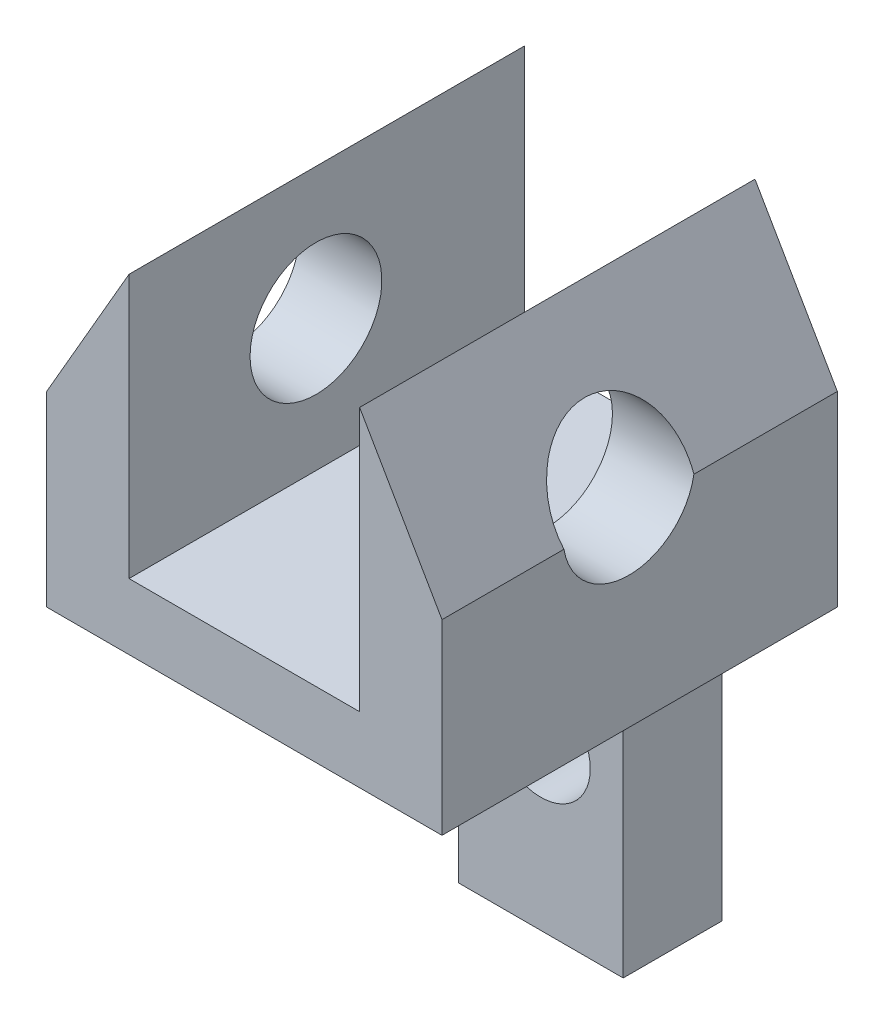
ISO-10303-21;
HEADER;
FILE_DESCRIPTION(('STEP AP214'),'2;1');
FILE_NAME('part.step','',(''),(''),'','','');
FILE_SCHEMA(('AUTOMOTIVE_DESIGN { 1 0 10303 214 1 1 1 1 }'));
ENDSEC;
DATA;
#1=APPLICATION_CONTEXT('core data for automotive mechanical design processes');
#2=APPLICATION_PROTOCOL_DEFINITION('international standard','automotive_design',2000,#1);
#3=PRODUCT_CONTEXT('',#1,'mechanical');
#4=PRODUCT('Part','Part','',(#3));
#5=PRODUCT_RELATED_PRODUCT_CATEGORY('part','',(#4));
#6=PRODUCT_DEFINITION_FORMATION('','',#4);
#7=PRODUCT_DEFINITION_CONTEXT('part definition',#1,'design');
#8=PRODUCT_DEFINITION('design','',#6,#7);
#9=PRODUCT_DEFINITION_SHAPE('','',#8);
#10=(LENGTH_UNIT() NAMED_UNIT(*) SI_UNIT(.MILLI.,.METRE.));
#11=(NAMED_UNIT(*) PLANE_ANGLE_UNIT() SI_UNIT($,.RADIAN.));
#12=(NAMED_UNIT(*) SI_UNIT($,.STERADIAN.) SOLID_ANGLE_UNIT());
#13=UNCERTAINTY_MEASURE_WITH_UNIT(LENGTH_MEASURE(1.E-05),#10,'distance_accuracy_value','');
#14=(GEOMETRIC_REPRESENTATION_CONTEXT(3) GLOBAL_UNCERTAINTY_ASSIGNED_CONTEXT((#13)) GLOBAL_UNIT_ASSIGNED_CONTEXT((#10,
#11,#12)) REPRESENTATION_CONTEXT('',''));
#15=CARTESIAN_POINT('',(0.,0.,0.));
#16=DIRECTION('',(0.,0.,1.));
#17=DIRECTION('',(1.,0.,0.));
#18=AXIS2_PLACEMENT_3D('',#15,#16,#17);
#19=CARTESIAN_POINT('',(-6.,2.,6.));
#20=DIRECTION('',(1.,0.,0.));
#21=DIRECTION('',(0.,0.,-1.));
#22=AXIS2_PLACEMENT_3D('',#19,#20,#21);
#23=PLANE('',#22);
#24=CARTESIAN_POINT('',(-6.,6.,0.326138493477825));
#25=DIRECTION('',(-1.,0.,0.));
#26=DIRECTION('',(0.,0.,1.));
#27=AXIS2_PLACEMENT_3D('',#24,#25,#26);
#28=CIRCLE('',#27,2.);
#29=CARTESIAN_POINT('',(-6.,5.66987298107782,-1.64642738663304));
#30=VERTEX_POINT('',#29);
#31=CARTESIAN_POINT('',(-6.,5.66987298107782,2.29870437358869));
#32=VERTEX_POINT('',#31);
#33=EDGE_CURVE('E171',#30,#32,#28,.T.);
#34=ORIENTED_EDGE('',*,*,#33,.F.);
#35=DIRECTION('',(0.,0.,1.));
#36=VECTOR('',#35,1.);
#37=CARTESIAN_POINT('',(-6.,5.66987298107782,-6.));
#38=LINE('',#37,#36);
#39=CARTESIAN_POINT('',(-6.,5.66987298107782,-6.));
#40=VERTEX_POINT('',#39);
#41=EDGE_CURVE('E210',#40,#30,#38,.T.);
#42=ORIENTED_EDGE('',*,*,#41,.F.);
#43=DIRECTION('',(0.,-1.,0.));
#44=VECTOR('',#43,1.);
#45=CARTESIAN_POINT('',(-6.,2.,-6.));
#46=LINE('',#45,#44);
#47=CARTESIAN_POINT('',(-6.,0.,-6.));
#48=VERTEX_POINT('',#47);
#49=EDGE_CURVE('E278',#40,#48,#46,.T.);
#50=ORIENTED_EDGE('',*,*,#49,.T.);
#51=DIRECTION('',(0.,0.,1.));
#52=VECTOR('',#51,1.);
#53=CARTESIAN_POINT('',(-6.,0.,6.));
#54=LINE('',#53,#52);
#55=CARTESIAN_POINT('',(-6.,0.,6.));
#56=VERTEX_POINT('',#55);
#57=EDGE_CURVE('E268',#48,#56,#54,.T.);
#58=ORIENTED_EDGE('',*,*,#57,.T.);
#59=DIRECTION('',(0.,-1.,0.));
#60=VECTOR('',#59,1.);
#61=CARTESIAN_POINT('',(-6.,2.,6.));
#62=LINE('',#61,#60);
#63=CARTESIAN_POINT('',(-6.,5.66987298107781,6.));
#64=VERTEX_POINT('',#63);
#65=EDGE_CURVE('E280',#64,#56,#62,.T.);
#66=ORIENTED_EDGE('',*,*,#65,.F.);
#67=EDGE_CURVE('E205',#32,#64,#38,.T.);
#68=ORIENTED_EDGE('',*,*,#67,.F.);
#69=EDGE_LOOP('',(#34,#42,#50,#58,#66,#68));
#70=FACE_BOUND('',#69,.T.);
#71=ADVANCED_FACE('F44',(#70),#23,.F.);
#72=CARTESIAN_POINT('',(-6.,2.,6.));
#73=DIRECTION('',(0.,0.,-1.));
#74=DIRECTION('',(-1.,0.,0.));
#75=AXIS2_PLACEMENT_3D('',#72,#73,#74);
#76=PLANE('',#75);
#77=DIRECTION('',(0.500000000000001,0.866025403784438,0.));
#78=VECTOR('',#77,1.);
#79=CARTESIAN_POINT('',(-3.5,10.,6.));
#80=LINE('',#79,#78);
#81=CARTESIAN_POINT('',(-3.5,10.,6.));
#82=VERTEX_POINT('',#81);
#83=EDGE_CURVE('E201',#64,#82,#80,.T.);
#84=ORIENTED_EDGE('',*,*,#83,.F.);
#85=ORIENTED_EDGE('',*,*,#65,.T.);
#86=DIRECTION('',(1.,0.,0.));
#87=VECTOR('',#86,1.);
#88=CARTESIAN_POINT('',(-6.,0.,6.));
#89=LINE('',#88,#87);
#90=CARTESIAN_POINT('',(6.,0.,6.));
#91=VERTEX_POINT('',#90);
#92=EDGE_CURVE('E260',#56,#91,#89,.T.);
#93=ORIENTED_EDGE('',*,*,#92,.T.);
#94=DIRECTION('',(0.,-1.,0.));
#95=VECTOR('',#94,1.);
#96=CARTESIAN_POINT('',(6.,2.,6.));
#97=LINE('',#96,#95);
#98=CARTESIAN_POINT('',(6.,5.66987298107782,6.));
#99=VERTEX_POINT('',#98);
#100=EDGE_CURVE('E257',#99,#91,#97,.T.);
#101=ORIENTED_EDGE('',*,*,#100,.F.);
#102=DIRECTION('',(0.500000000000001,-0.866025403784438,0.));
#103=VECTOR('',#102,1.);
#104=CARTESIAN_POINT('',(3.5,10.,6.));
#105=LINE('',#104,#103);
#106=CARTESIAN_POINT('',(3.5,10.,6.));
#107=VERTEX_POINT('',#106);
#108=EDGE_CURVE('E206',#107,#99,#105,.T.);
#109=ORIENTED_EDGE('',*,*,#108,.F.);
#110=DIRECTION('',(0.,-1.,0.));
#111=VECTOR('',#110,1.);
#112=CARTESIAN_POINT('',(3.5,10.,6.));
#113=LINE('',#112,#111);
#114=CARTESIAN_POINT('',(3.5,2.,6.));
#115=VERTEX_POINT('',#114);
#116=EDGE_CURVE('E245',#107,#115,#113,.T.);
#117=ORIENTED_EDGE('',*,*,#116,.T.);
#118=DIRECTION('',(1.,0.,0.));
#119=VECTOR('',#118,1.);
#120=CARTESIAN_POINT('',(-6.,2.,6.));
#121=LINE('',#120,#119);
#122=CARTESIAN_POINT('',(-3.5,2.,6.));
#123=VERTEX_POINT('',#122);
#124=EDGE_CURVE('E258',#123,#115,#121,.T.);
#125=ORIENTED_EDGE('',*,*,#124,.F.);
#126=DIRECTION('',(0.,-1.,0.));
#127=VECTOR('',#126,1.);
#128=CARTESIAN_POINT('',(-3.5,10.,6.));
#129=LINE('',#128,#127);
#130=EDGE_CURVE('E232',#82,#123,#129,.T.);
#131=ORIENTED_EDGE('',*,*,#130,.F.);
#132=EDGE_LOOP('',(#84,#85,#93,#101,#109,#117,#125,#131));
#133=FACE_BOUND('',#132,.T.);
#134=ADVANCED_FACE('F298',(#133),#76,.F.);
#135=CARTESIAN_POINT('',(0.,2.,0.));
#136=DIRECTION('',(0.,-1.,0.));
#137=DIRECTION('',(0.,0.,-1.));
#138=AXIS2_PLACEMENT_3D('',#135,#136,#137);
#139=PLANE('',#138);
#140=DIRECTION('',(0.,0.,-1.));
#141=VECTOR('',#140,1.);
#142=CARTESIAN_POINT('',(-3.5,2.,-6.));
#143=LINE('',#142,#141);
#144=CARTESIAN_POINT('',(-3.5,2.,-6.));
#145=VERTEX_POINT('',#144);
#146=EDGE_CURVE('E226',#123,#145,#143,.T.);
#147=ORIENTED_EDGE('',*,*,#146,.F.);
#148=ORIENTED_EDGE('',*,*,#124,.T.);
#149=DIRECTION('',(0.,0.,1.));
#150=VECTOR('',#149,1.);
#151=CARTESIAN_POINT('',(3.5,2.,6.));
#152=LINE('',#151,#150);
#153=CARTESIAN_POINT('',(3.5,2.,-6.));
#154=VERTEX_POINT('',#153);
#155=EDGE_CURVE('E234',#154,#115,#152,.T.);
#156=ORIENTED_EDGE('',*,*,#155,.F.);
#157=DIRECTION('',(-1.,0.,0.));
#158=VECTOR('',#157,1.);
#159=CARTESIAN_POINT('',(-6.,2.,-6.));
#160=LINE('',#159,#158);
#161=EDGE_CURVE('E251',#154,#145,#160,.T.);
#162=ORIENTED_EDGE('',*,*,#161,.T.);
#163=EDGE_LOOP('',(#147,#148,#156,#162));
#164=FACE_BOUND('',#163,.T.);
#165=ADVANCED_FACE('F348',(#164),#139,.F.);
#166=CARTESIAN_POINT('',(6.,2.,6.));
#167=DIRECTION('',(-1.,0.,0.));
#168=DIRECTION('',(0.,0.,1.));
#169=AXIS2_PLACEMENT_3D('',#166,#167,#168);
#170=PLANE('',#169);
#171=DIRECTION('',(0.,0.,1.));
#172=VECTOR('',#171,1.);
#173=CARTESIAN_POINT('',(6.,5.66987298107782,-6.));
#174=LINE('',#173,#172);
#175=CARTESIAN_POINT('',(6.,5.66987298107782,-6.));
#176=VERTEX_POINT('',#175);
#177=CARTESIAN_POINT('',(6.,5.66987298107782,-1.64642738663304));
#178=VERTEX_POINT('',#177);
#179=EDGE_CURVE('E215',#176,#178,#174,.T.);
#180=ORIENTED_EDGE('',*,*,#179,.T.);
#181=CARTESIAN_POINT('',(6.,6.,0.326138493477825));
#182=DIRECTION('',(-1.,0.,0.));
#183=DIRECTION('',(0.,0.,1.));
#184=AXIS2_PLACEMENT_3D('',#181,#182,#183);
#185=CIRCLE('',#184,2.);
#186=CARTESIAN_POINT('',(6.,5.66987298107782,2.29870437358869));
#187=VERTEX_POINT('',#186);
#188=EDGE_CURVE('E179',#178,#187,#185,.T.);
#189=ORIENTED_EDGE('',*,*,#188,.T.);
#190=EDGE_CURVE('E197',#187,#99,#174,.T.);
#191=ORIENTED_EDGE('',*,*,#190,.T.);
#192=ORIENTED_EDGE('',*,*,#100,.T.);
#193=DIRECTION('',(0.,0.,-1.));
#194=VECTOR('',#193,1.);
#195=CARTESIAN_POINT('',(6.,0.,6.));
#196=LINE('',#195,#194);
#197=CARTESIAN_POINT('',(6.,0.,-6.));
#198=VERTEX_POINT('',#197);
#199=EDGE_CURVE('E239',#91,#198,#196,.T.);
#200=ORIENTED_EDGE('',*,*,#199,.T.);
#201=DIRECTION('',(0.,-1.,0.));
#202=VECTOR('',#201,1.);
#203=CARTESIAN_POINT('',(6.,2.,-6.));
#204=LINE('',#203,#202);
#205=EDGE_CURVE('E53',#176,#198,#204,.T.);
#206=ORIENTED_EDGE('',*,*,#205,.F.);
#207=EDGE_LOOP('',(#180,#189,#191,#192,#200,#206));
#208=FACE_BOUND('',#207,.T.);
#209=ADVANCED_FACE('F50',(#208),#170,.F.);
#210=CARTESIAN_POINT('',(-6.,2.,-6.));
#211=DIRECTION('',(0.,0.,1.));
#212=DIRECTION('',(1.,0.,0.));
#213=AXIS2_PLACEMENT_3D('',#210,#211,#212);
#214=PLANE('',#213);
#215=CARTESIAN_POINT('',(0.,-5.,-6.));
#216=DIRECTION('',(0.,0.,1.));
#217=DIRECTION('',(1.,0.,0.));
#218=AXIS2_PLACEMENT_3D('',#215,#216,#217);
#219=CIRCLE('',#218,1.49999999999999);
#220=CARTESIAN_POINT('',(1.49999999999999,-5.,-6.));
#221=VERTEX_POINT('',#220);
#222=EDGE_CURVE('E357',#221,#221,#219,.T.);
#223=ORIENTED_EDGE('',*,*,#222,.T.);
#224=EDGE_LOOP('',(#223));
#225=FACE_BOUND('',#224,.T.);
#226=ORIENTED_EDGE('',*,*,#49,.F.);
#227=DIRECTION('',(0.500000000000001,0.866025403784438,0.));
#228=VECTOR('',#227,1.);
#229=CARTESIAN_POINT('',(-3.5,10.,-6.));
#230=LINE('',#229,#228);
#231=CARTESIAN_POINT('',(-3.5,10.,-6.));
#232=VERTEX_POINT('',#231);
#233=EDGE_CURVE('E196',#40,#232,#230,.T.);
#234=ORIENTED_EDGE('',*,*,#233,.T.);
#235=DIRECTION('',(0.,-1.,0.));
#236=VECTOR('',#235,1.);
#237=CARTESIAN_POINT('',(-3.5,10.,-6.));
#238=LINE('',#237,#236);
#239=EDGE_CURVE('E229',#232,#145,#238,.T.);
#240=ORIENTED_EDGE('',*,*,#239,.T.);
#241=ORIENTED_EDGE('',*,*,#161,.F.);
#242=DIRECTION('',(0.,-1.,0.));
#243=VECTOR('',#242,1.);
#244=CARTESIAN_POINT('',(3.5,10.,-6.));
#245=LINE('',#244,#243);
#246=CARTESIAN_POINT('',(3.5,10.,-6.));
#247=VERTEX_POINT('',#246);
#248=EDGE_CURVE('E211',#247,#154,#245,.T.);
#249=ORIENTED_EDGE('',*,*,#248,.F.);
#250=DIRECTION('',(0.500000000000001,-0.866025403784438,0.));
#251=VECTOR('',#250,1.);
#252=CARTESIAN_POINT('',(3.5,10.,-6.));
#253=LINE('',#252,#251);
#254=EDGE_CURVE('E216',#247,#176,#253,.T.);
#255=ORIENTED_EDGE('',*,*,#254,.T.);
#256=ORIENTED_EDGE('',*,*,#205,.T.);
#257=DIRECTION('',(-1.,0.,0.));
#258=VECTOR('',#257,1.);
#259=CARTESIAN_POINT('',(-6.,0.,-6.));
#260=LINE('',#259,#258);
#261=CARTESIAN_POINT('',(2.5,0.,-6.));
#262=VERTEX_POINT('',#261);
#263=EDGE_CURVE('E262',#198,#262,#260,.T.);
#264=ORIENTED_EDGE('',*,*,#263,.T.);
#265=DIRECTION('',(0.,1.,0.));
#266=VECTOR('',#265,1.);
#267=CARTESIAN_POINT('',(2.5,-10.,-6.));
#268=LINE('',#267,#266);
#269=CARTESIAN_POINT('',(2.5,-10.,-6.));
#270=VERTEX_POINT('',#269);
#271=EDGE_CURVE('E372',#270,#262,#268,.T.);
#272=ORIENTED_EDGE('',*,*,#271,.F.);
#273=DIRECTION('',(1.,0.,0.));
#274=VECTOR('',#273,1.);
#275=CARTESIAN_POINT('',(2.5,-10.,-6.));
#276=LINE('',#275,#274);
#277=CARTESIAN_POINT('',(-2.5,-10.,-6.));
#278=VERTEX_POINT('',#277);
#279=EDGE_CURVE('E165',#278,#270,#276,.T.);
#280=ORIENTED_EDGE('',*,*,#279,.F.);
#281=DIRECTION('',(0.,1.,0.));
#282=VECTOR('',#281,1.);
#283=CARTESIAN_POINT('',(-2.5,-10.,-6.));
#284=LINE('',#283,#282);
#285=CARTESIAN_POINT('',(-2.5,0.,-6.));
#286=VERTEX_POINT('',#285);
#287=EDGE_CURVE('E180',#278,#286,#284,.T.);
#288=ORIENTED_EDGE('',*,*,#287,.T.);
#289=EDGE_CURVE('E66',#286,#48,#260,.T.);
#290=ORIENTED_EDGE('',*,*,#289,.T.);
#291=EDGE_LOOP('',(#226,#234,#240,#241,#249,#255,#256,#264,#272,#280,#288,#290));
#292=FACE_BOUND('',#291,.T.);
#293=ADVANCED_FACE('F290',(#225,#292),#214,.F.);
#294=CARTESIAN_POINT('',(0.,0.,0.));
#295=DIRECTION('',(0.,-1.,0.));
#296=DIRECTION('',(0.,0.,-1.));
#297=AXIS2_PLACEMENT_3D('',#294,#295,#296);
#298=PLANE('',#297);
#299=DIRECTION('',(0.,0.,1.));
#300=VECTOR('',#299,1.);
#301=CARTESIAN_POINT('',(2.5,0.,-6.));
#302=LINE('',#301,#300);
#303=CARTESIAN_POINT('',(2.5,0.,-3.));
#304=VERTEX_POINT('',#303);
#305=EDGE_CURVE('E168',#262,#304,#302,.T.);
#306=ORIENTED_EDGE('',*,*,#305,.F.);
#307=ORIENTED_EDGE('',*,*,#263,.F.);
#308=ORIENTED_EDGE('',*,*,#199,.F.);
#309=ORIENTED_EDGE('',*,*,#92,.F.);
#310=ORIENTED_EDGE('',*,*,#57,.F.);
#311=ORIENTED_EDGE('',*,*,#289,.F.);
#312=DIRECTION('',(0.,0.,-1.));
#313=VECTOR('',#312,1.);
#314=CARTESIAN_POINT('',(-2.5,0.,-6.));
#315=LINE('',#314,#313);
#316=CARTESIAN_POINT('',(-2.5,0.,-3.));
#317=VERTEX_POINT('',#316);
#318=EDGE_CURVE('E170',#317,#286,#315,.T.);
#319=ORIENTED_EDGE('',*,*,#318,.F.);
#320=DIRECTION('',(-1.,0.,0.));
#321=VECTOR('',#320,1.);
#322=CARTESIAN_POINT('',(2.5,0.,-3.));
#323=LINE('',#322,#321);
#324=EDGE_CURVE('E64',#304,#317,#323,.T.);
#325=ORIENTED_EDGE('',*,*,#324,.F.);
#326=EDGE_LOOP('',(#306,#307,#308,#309,#310,#311,#319,#325));
#327=FACE_BOUND('',#326,.T.);
#328=ADVANCED_FACE('F295',(#327),#298,.T.);
#329=CARTESIAN_POINT('',(3.5,10.,6.));
#330=DIRECTION('',(1.,0.,0.));
#331=DIRECTION('',(0.,0.,-1.));
#332=AXIS2_PLACEMENT_3D('',#329,#330,#331);
#333=PLANE('',#332);
#334=CARTESIAN_POINT('',(3.5,6.,0.326138493477825));
#335=DIRECTION('',(1.,0.,0.));
#336=DIRECTION('',(0.,0.,-1.));
#337=AXIS2_PLACEMENT_3D('',#334,#335,#336);
#338=CIRCLE('',#337,2.);
#339=CARTESIAN_POINT('',(3.5,6.,-1.67386150652218));
#340=VERTEX_POINT('',#339);
#341=EDGE_CURVE('E195',#340,#340,#338,.T.);
#342=ORIENTED_EDGE('',*,*,#341,.T.);
#343=EDGE_LOOP('',(#342));
#344=FACE_BOUND('',#343,.T.);
#345=ORIENTED_EDGE('',*,*,#155,.T.);
#346=ORIENTED_EDGE('',*,*,#116,.F.);
#347=DIRECTION('',(0.,0.,1.));
#348=VECTOR('',#347,1.);
#349=CARTESIAN_POINT('',(3.5,10.,6.));
#350=LINE('',#349,#348);
#351=EDGE_CURVE('E246',#247,#107,#350,.T.);
#352=ORIENTED_EDGE('',*,*,#351,.F.);
#353=ORIENTED_EDGE('',*,*,#248,.T.);
#354=EDGE_LOOP('',(#345,#346,#352,#353));
#355=FACE_BOUND('',#354,.T.);
#356=ADVANCED_FACE('F325',(#344,#355),#333,.F.);
#357=CARTESIAN_POINT('',(-3.5,10.,-6.));
#358=DIRECTION('',(-1.,0.,0.));
#359=DIRECTION('',(0.,0.,1.));
#360=AXIS2_PLACEMENT_3D('',#357,#358,#359);
#361=PLANE('',#360);
#362=CARTESIAN_POINT('',(-3.5,6.,0.326138493477825));
#363=DIRECTION('',(-1.,0.,0.));
#364=DIRECTION('',(0.,0.,1.));
#365=AXIS2_PLACEMENT_3D('',#362,#363,#364);
#366=CIRCLE('',#365,2.);
#367=CARTESIAN_POINT('',(-3.5,6.,2.32613849347783));
#368=VERTEX_POINT('',#367);
#369=EDGE_CURVE('E188',#368,#368,#366,.T.);
#370=ORIENTED_EDGE('',*,*,#369,.T.);
#371=EDGE_LOOP('',(#370));
#372=FACE_BOUND('',#371,.T.);
#373=ORIENTED_EDGE('',*,*,#146,.T.);
#374=ORIENTED_EDGE('',*,*,#239,.F.);
#375=DIRECTION('',(0.,0.,-1.));
#376=VECTOR('',#375,1.);
#377=CARTESIAN_POINT('',(-3.5,10.,-6.));
#378=LINE('',#377,#376);
#379=EDGE_CURVE('E224',#82,#232,#378,.T.);
#380=ORIENTED_EDGE('',*,*,#379,.F.);
#381=ORIENTED_EDGE('',*,*,#130,.T.);
#382=EDGE_LOOP('',(#373,#374,#380,#381));
#383=FACE_BOUND('',#382,.T.);
#384=ADVANCED_FACE('F320',(#372,#383),#361,.F.);
#385=CARTESIAN_POINT('',(3.5,10.,-6.));
#386=DIRECTION('',(-0.866025403784438,-0.500000000000001,0.));
#387=DIRECTION('',(0.500000000000001,-0.866025403784438,0.));
#388=AXIS2_PLACEMENT_3D('',#385,#386,#387);
#389=PLANE('',#388);
#390=ORIENTED_EDGE('',*,*,#190,.F.);
#391=CARTESIAN_POINT('',(5.80940107675851,6.,0.326138493477825));
#392=DIRECTION('',(-0.866025403784438,-0.500000000000001,0.));
#393=DIRECTION('',(-0.500000000000001,0.866025403784438,0.));
#394=AXIS2_PLACEMENT_3D('',#391,#392,#393);
#395=ELLIPSE('',#394,2.30940107675851,2.);
#396=EDGE_CURVE('E183',#187,#178,#395,.T.);
#397=ORIENTED_EDGE('',*,*,#396,.T.);
#398=ORIENTED_EDGE('',*,*,#179,.F.);
#399=ORIENTED_EDGE('',*,*,#254,.F.);
#400=ORIENTED_EDGE('',*,*,#351,.T.);
#401=ORIENTED_EDGE('',*,*,#108,.T.);
#402=EDGE_LOOP('',(#390,#397,#398,#399,#400,#401));
#403=FACE_BOUND('',#402,.T.);
#404=ADVANCED_FACE('F324',(#403),#389,.F.);
#405=CARTESIAN_POINT('',(-3.5,10.,-6.));
#406=DIRECTION('',(0.866025403784438,-0.500000000000001,0.));
#407=DIRECTION('',(0.500000000000001,0.866025403784438,0.));
#408=AXIS2_PLACEMENT_3D('',#405,#406,#407);
#409=PLANE('',#408);
#410=ORIENTED_EDGE('',*,*,#41,.T.);
#411=CARTESIAN_POINT('',(-5.80940107675851,6.,0.326138493477825));
#412=DIRECTION('',(0.866025403784438,-0.500000000000001,0.));
#413=DIRECTION('',(-0.500000000000001,-0.866025403784438,0.));
#414=AXIS2_PLACEMENT_3D('',#411,#412,#413);
#415=ELLIPSE('',#414,2.30940107675851,2.);
#416=EDGE_CURVE('E11',#30,#32,#415,.T.);
#417=ORIENTED_EDGE('',*,*,#416,.T.);
#418=ORIENTED_EDGE('',*,*,#67,.T.);
#419=ORIENTED_EDGE('',*,*,#83,.T.);
#420=ORIENTED_EDGE('',*,*,#379,.T.);
#421=ORIENTED_EDGE('',*,*,#233,.F.);
#422=EDGE_LOOP('',(#410,#417,#418,#419,#420,#421));
#423=FACE_BOUND('',#422,.T.);
#424=ADVANCED_FACE('F315',(#423),#409,.F.);
#425=CARTESIAN_POINT('',(6.,6.,0.326138493477825));
#426=DIRECTION('',(-1.,0.,0.));
#427=DIRECTION('',(0.,0.,1.));
#428=AXIS2_PLACEMENT_3D('',#425,#426,#427);
#429=CYLINDRICAL_SURFACE('',#428,2.);
#430=ORIENTED_EDGE('',*,*,#33,.T.);
#431=ORIENTED_EDGE('',*,*,#416,.F.);
#432=EDGE_LOOP('',(#430,#431));
#433=FACE_BOUND('',#432,.T.);
#434=ORIENTED_EDGE('',*,*,#369,.F.);
#435=EDGE_LOOP('',(#434));
#436=FACE_BOUND('',#435,.T.);
#437=ADVANCED_FACE('F329',(#433,#436),#429,.F.);
#438=ORIENTED_EDGE('',*,*,#188,.F.);
#439=ORIENTED_EDGE('',*,*,#396,.F.);
#440=EDGE_LOOP('',(#438,#439));
#441=FACE_BOUND('',#440,.T.);
#442=ORIENTED_EDGE('',*,*,#341,.F.);
#443=EDGE_LOOP('',(#442));
#444=FACE_BOUND('',#443,.T.);
#445=ADVANCED_FACE('F330',(#441,#444),#429,.F.);
#446=CARTESIAN_POINT('',(2.5,-10.,-6.));
#447=DIRECTION('',(-1.,0.,0.));
#448=DIRECTION('',(0.,0.,1.));
#449=AXIS2_PLACEMENT_3D('',#446,#447,#448);
#450=PLANE('',#449);
#451=ORIENTED_EDGE('',*,*,#305,.T.);
#452=DIRECTION('',(0.,1.,0.));
#453=VECTOR('',#452,1.);
#454=CARTESIAN_POINT('',(2.5,-10.,-3.));
#455=LINE('',#454,#453);
#456=CARTESIAN_POINT('',(2.5,-10.,-3.));
#457=VERTEX_POINT('',#456);
#458=EDGE_CURVE('E149',#457,#304,#455,.T.);
#459=ORIENTED_EDGE('',*,*,#458,.F.);
#460=DIRECTION('',(0.,0.,1.));
#461=VECTOR('',#460,1.);
#462=CARTESIAN_POINT('',(2.5,-10.,-6.));
#463=LINE('',#462,#461);
#464=EDGE_CURVE('E160',#270,#457,#463,.T.);
#465=ORIENTED_EDGE('',*,*,#464,.F.);
#466=ORIENTED_EDGE('',*,*,#271,.T.);
#467=EDGE_LOOP('',(#451,#459,#465,#466));
#468=FACE_BOUND('',#467,.T.);
#469=ADVANCED_FACE('F166',(#468),#450,.F.);
#470=CARTESIAN_POINT('',(2.5,-10.,-3.));
#471=DIRECTION('',(0.,0.,-1.));
#472=DIRECTION('',(-1.,0.,0.));
#473=AXIS2_PLACEMENT_3D('',#470,#471,#472);
#474=PLANE('',#473);
#475=CARTESIAN_POINT('',(0.,-5.,-3.));
#476=DIRECTION('',(0.,0.,1.));
#477=DIRECTION('',(1.,0.,0.));
#478=AXIS2_PLACEMENT_3D('',#475,#476,#477);
#479=CIRCLE('',#478,1.49999999999999);
#480=CARTESIAN_POINT('',(1.49999999999999,-5.,-3.));
#481=VERTEX_POINT('',#480);
#482=EDGE_CURVE('E361',#481,#481,#479,.T.);
#483=ORIENTED_EDGE('',*,*,#482,.F.);
#484=EDGE_LOOP('',(#483));
#485=FACE_BOUND('',#484,.T.);
#486=ORIENTED_EDGE('',*,*,#324,.T.);
#487=DIRECTION('',(0.,1.,0.));
#488=VECTOR('',#487,1.);
#489=CARTESIAN_POINT('',(-2.5,-10.,-3.));
#490=LINE('',#489,#488);
#491=CARTESIAN_POINT('',(-2.5,-10.,-3.));
#492=VERTEX_POINT('',#491);
#493=EDGE_CURVE('E155',#492,#317,#490,.T.);
#494=ORIENTED_EDGE('',*,*,#493,.F.);
#495=DIRECTION('',(-1.,0.,0.));
#496=VECTOR('',#495,1.);
#497=CARTESIAN_POINT('',(2.5,-10.,-3.));
#498=LINE('',#497,#496);
#499=EDGE_CURVE('E144',#457,#492,#498,.T.);
#500=ORIENTED_EDGE('',*,*,#499,.F.);
#501=ORIENTED_EDGE('',*,*,#458,.T.);
#502=EDGE_LOOP('',(#486,#494,#500,#501));
#503=FACE_BOUND('',#502,.T.);
#504=ADVANCED_FACE('F150',(#485,#503),#474,.F.);
#505=CARTESIAN_POINT('',(-2.5,-10.,-6.));
#506=DIRECTION('',(1.,0.,0.));
#507=DIRECTION('',(0.,0.,-1.));
#508=AXIS2_PLACEMENT_3D('',#505,#506,#507);
#509=PLANE('',#508);
#510=ORIENTED_EDGE('',*,*,#318,.T.);
#511=ORIENTED_EDGE('',*,*,#287,.F.);
#512=DIRECTION('',(0.,0.,-1.));
#513=VECTOR('',#512,1.);
#514=CARTESIAN_POINT('',(-2.5,-10.,-6.));
#515=LINE('',#514,#513);
#516=EDGE_CURVE('E156',#492,#278,#515,.T.);
#517=ORIENTED_EDGE('',*,*,#516,.F.);
#518=ORIENTED_EDGE('',*,*,#493,.T.);
#519=EDGE_LOOP('',(#510,#511,#517,#518));
#520=FACE_BOUND('',#519,.T.);
#521=ADVANCED_FACE('F382',(#520),#509,.F.);
#522=CARTESIAN_POINT('',(0.,-10.,0.));
#523=DIRECTION('',(0.,-1.,0.));
#524=DIRECTION('',(0.,0.,-1.));
#525=AXIS2_PLACEMENT_3D('',#522,#523,#524);
#526=PLANE('',#525);
#527=ORIENTED_EDGE('',*,*,#464,.T.);
#528=ORIENTED_EDGE('',*,*,#499,.T.);
#529=ORIENTED_EDGE('',*,*,#516,.T.);
#530=ORIENTED_EDGE('',*,*,#279,.T.);
#531=EDGE_LOOP('',(#527,#528,#529,#530));
#532=FACE_BOUND('',#531,.T.);
#533=ADVANCED_FACE('F159',(#532),#526,.T.);
#534=CARTESIAN_POINT('',(0.,-5.,-3.));
#535=DIRECTION('',(0.,0.,1.));
#536=DIRECTION('',(1.,0.,0.));
#537=AXIS2_PLACEMENT_3D('',#534,#535,#536);
#538=CYLINDRICAL_SURFACE('',#537,1.49999999999999);
#539=ORIENTED_EDGE('',*,*,#222,.F.);
#540=EDGE_LOOP('',(#539));
#541=FACE_BOUND('',#540,.T.);
#542=ORIENTED_EDGE('',*,*,#482,.T.);
#543=EDGE_LOOP('',(#542));
#544=FACE_BOUND('',#543,.T.);
#545=ADVANCED_FACE('F386',(#541,#544),#538,.F.);
#546=CLOSED_SHELL('',(#71,#134,#165,#209,#293,#328,#356,#384,#404,#424,#437,#445,#469,#504,#521,
#533,#545));
#547=MANIFOLD_SOLID_BREP('B2',#546);
#548=ADVANCED_BREP_SHAPE_REPRESENTATION('',(#18,#547),#14);
#549=SHAPE_DEFINITION_REPRESENTATION(#9,#548);
ENDSEC;
END-ISO-10303-21;
